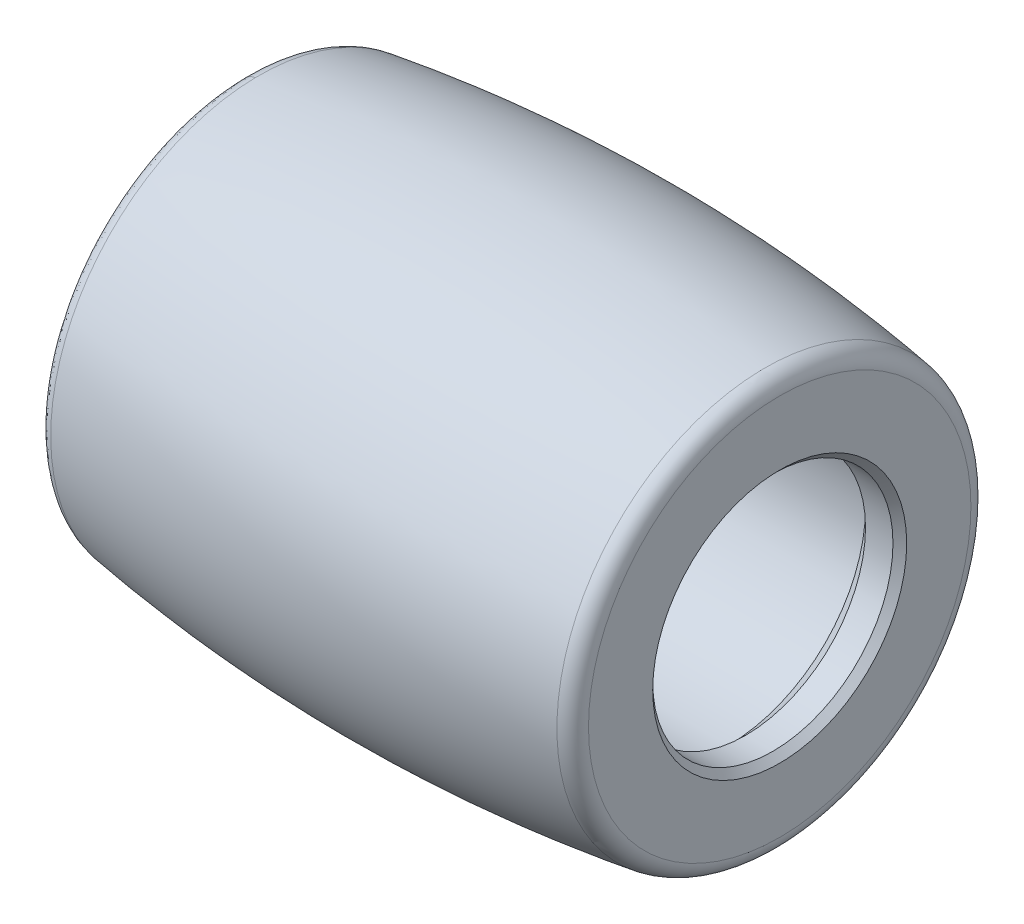
ISO-10303-21;
HEADER;
FILE_DESCRIPTION(('STEP AP214'),'2;1');
FILE_NAME('part.step','',(''),(''),'','','');
FILE_SCHEMA(('AUTOMOTIVE_DESIGN { 1 0 10303 214 1 1 1 1 }'));
ENDSEC;
DATA;
#1=APPLICATION_CONTEXT('core data for automotive mechanical design processes');
#2=APPLICATION_PROTOCOL_DEFINITION('international standard','automotive_design',2000,#1);
#3=PRODUCT_CONTEXT('',#1,'mechanical');
#4=PRODUCT('Part','Part','',(#3));
#5=PRODUCT_RELATED_PRODUCT_CATEGORY('part','',(#4));
#6=PRODUCT_DEFINITION_FORMATION('','',#4);
#7=PRODUCT_DEFINITION_CONTEXT('part definition',#1,'design');
#8=PRODUCT_DEFINITION('design','',#6,#7);
#9=PRODUCT_DEFINITION_SHAPE('','',#8);
#10=(LENGTH_UNIT() NAMED_UNIT(*) SI_UNIT(.MILLI.,.METRE.));
#11=(NAMED_UNIT(*) PLANE_ANGLE_UNIT() SI_UNIT($,.RADIAN.));
#12=(NAMED_UNIT(*) SI_UNIT($,.STERADIAN.) SOLID_ANGLE_UNIT());
#13=UNCERTAINTY_MEASURE_WITH_UNIT(LENGTH_MEASURE(1.E-05),#10,'distance_accuracy_value','');
#14=(GEOMETRIC_REPRESENTATION_CONTEXT(3) GLOBAL_UNCERTAINTY_ASSIGNED_CONTEXT((#13)) GLOBAL_UNIT_ASSIGNED_CONTEXT((#10,
#11,#12)) REPRESENTATION_CONTEXT('',''));
#15=CARTESIAN_POINT('',(0.,0.,0.));
#16=DIRECTION('',(0.,0.,1.));
#17=DIRECTION('',(1.,0.,0.));
#18=AXIS2_PLACEMENT_3D('',#15,#16,#17);
#19=CARTESIAN_POINT('',(-7.8,0.,0.));
#20=DIRECTION('',(-1.,0.,0.));
#21=DIRECTION('',(0.,0.,1.));
#22=AXIS2_PLACEMENT_3D('',#19,#20,#21);
#23=CYLINDRICAL_SURFACE('',#22,4.);
#24=CARTESIAN_POINT('',(6.29999999995334,0.,0.));
#25=DIRECTION('',(-1.,0.,0.));
#26=DIRECTION('',(0.,0.,1.));
#27=AXIS2_PLACEMENT_3D('',#24,#25,#26);
#28=CIRCLE('',#27,3.99999999996226);
#29=CARTESIAN_POINT('',(6.29999999995334,0.,3.99999999996226));
#30=VERTEX_POINT('',#29);
#31=EDGE_CURVE('E97',#30,#30,#28,.F.);
#32=ORIENTED_EDGE('',*,*,#31,.T.);
#33=EDGE_LOOP('',(#32));
#34=FACE_BOUND('',#33,.T.);
#35=CARTESIAN_POINT('',(-6.29999999995334,0.,0.));
#36=DIRECTION('',(1.,0.,0.));
#37=DIRECTION('',(0.,0.,-1.));
#38=AXIS2_PLACEMENT_3D('',#35,#36,#37);
#39=CIRCLE('',#38,3.99999999996226);
#40=CARTESIAN_POINT('',(-6.29999999995334,0.,-3.99999999996226));
#41=VERTEX_POINT('',#40);
#42=EDGE_CURVE('E100',#41,#41,#39,.F.);
#43=ORIENTED_EDGE('',*,*,#42,.T.);
#44=EDGE_LOOP('',(#43));
#45=FACE_BOUND('',#44,.T.);
#46=ADVANCED_FACE('F17',(#34,#45),#23,.F.);
#47=CARTESIAN_POINT('',(-6.29999999995334,0.,0.));
#48=DIRECTION('',(1.,0.,0.));
#49=DIRECTION('',(0.,0.,-1.));
#50=AXIS2_PLACEMENT_3D('',#47,#48,#49);
#51=CONICAL_SURFACE('',#50,3.99999999996226,0.785398163340605);
#52=CARTESIAN_POINT('',(-6.8,0.,0.));
#53=DIRECTION('',(1.,0.,0.));
#54=DIRECTION('',(0.,0.,-1.));
#55=AXIS2_PLACEMENT_3D('',#52,#53,#54);
#56=CIRCLE('',#55,3.5);
#57=CARTESIAN_POINT('',(-6.8,0.,-3.5));
#58=VERTEX_POINT('',#57);
#59=EDGE_CURVE('E94',#58,#58,#56,.F.);
#60=ORIENTED_EDGE('',*,*,#59,.T.);
#61=EDGE_LOOP('',(#60));
#62=FACE_BOUND('',#61,.T.);
#63=ORIENTED_EDGE('',*,*,#42,.F.);
#64=EDGE_LOOP('',(#63));
#65=FACE_BOUND('',#64,.T.);
#66=ADVANCED_FACE('F191',(#62,#65),#51,.F.);
#67=CARTESIAN_POINT('',(6.29999999995334,0.,0.));
#68=DIRECTION('',(-1.,0.,0.));
#69=DIRECTION('',(0.,0.,1.));
#70=AXIS2_PLACEMENT_3D('',#67,#68,#69);
#71=CONICAL_SURFACE('',#70,3.99999999996226,0.785398163340605);
#72=CARTESIAN_POINT('',(6.8,0.,0.));
#73=DIRECTION('',(1.,0.,0.));
#74=DIRECTION('',(0.,0.,-1.));
#75=AXIS2_PLACEMENT_3D('',#72,#73,#74);
#76=CIRCLE('',#75,3.5);
#77=CARTESIAN_POINT('',(6.8,0.,-3.5));
#78=VERTEX_POINT('',#77);
#79=EDGE_CURVE('E91',#78,#78,#76,.T.);
#80=ORIENTED_EDGE('',*,*,#79,.T.);
#81=EDGE_LOOP('',(#80));
#82=FACE_BOUND('',#81,.T.);
#83=ORIENTED_EDGE('',*,*,#31,.F.);
#84=EDGE_LOOP('',(#83));
#85=FACE_BOUND('',#84,.T.);
#86=ADVANCED_FACE('F195',(#82,#85),#71,.F.);
#87=CARTESIAN_POINT('',(-7.8,0.,0.));
#88=DIRECTION('',(1.,0.,0.));
#89=DIRECTION('',(0.,0.,-1.));
#90=AXIS2_PLACEMENT_3D('',#87,#88,#89);
#91=CYLINDRICAL_SURFACE('',#90,3.5);
#92=CARTESIAN_POINT('',(-7.60000000002492,0.,0.));
#93=DIRECTION('',(-1.,0.,0.));
#94=DIRECTION('',(0.,0.,1.));
#95=AXIS2_PLACEMENT_3D('',#92,#93,#94);
#96=CIRCLE('',#95,3.50000000003092);
#97=CARTESIAN_POINT('',(-7.60000000002492,0.,3.50000000003092));
#98=VERTEX_POINT('',#97);
#99=EDGE_CURVE('E88',#98,#98,#96,.T.);
#100=ORIENTED_EDGE('',*,*,#99,.T.);
#101=EDGE_LOOP('',(#100));
#102=FACE_BOUND('',#101,.T.);
#103=ORIENTED_EDGE('',*,*,#59,.F.);
#104=EDGE_LOOP('',(#103));
#105=FACE_BOUND('',#104,.T.);
#106=ADVANCED_FACE('F199',(#102,#105),#91,.F.);
#107=CARTESIAN_POINT('',(7.8,0.,0.));
#108=DIRECTION('',(1.,0.,0.));
#109=DIRECTION('',(0.,0.,-1.));
#110=AXIS2_PLACEMENT_3D('',#107,#108,#109);
#111=CYLINDRICAL_SURFACE('',#110,3.5);
#112=ORIENTED_EDGE('',*,*,#79,.F.);
#113=EDGE_LOOP('',(#112));
#114=FACE_BOUND('',#113,.T.);
#115=CARTESIAN_POINT('',(7.60000000002492,0.,0.));
#116=DIRECTION('',(1.,0.,0.));
#117=DIRECTION('',(0.,0.,-1.));
#118=AXIS2_PLACEMENT_3D('',#115,#116,#117);
#119=CIRCLE('',#118,3.50000000003092);
#120=CARTESIAN_POINT('',(7.60000000002492,0.,-3.50000000003092));
#121=VERTEX_POINT('',#120);
#122=EDGE_CURVE('E85',#121,#121,#119,.T.);
#123=ORIENTED_EDGE('',*,*,#122,.T.);
#124=EDGE_LOOP('',(#123));
#125=FACE_BOUND('',#124,.T.);
#126=ADVANCED_FACE('F203',(#114,#125),#111,.F.);
#127=CARTESIAN_POINT('',(-7.79999999991787,0.,0.));
#128=DIRECTION('',(-1.,0.,0.));
#129=DIRECTION('',(0.,0.,1.));
#130=AXIS2_PLACEMENT_3D('',#127,#128,#129);
#131=CONICAL_SURFACE('',#130,3.69999999992388,0.785398163397448);
#132=ORIENTED_EDGE('',*,*,#99,.F.);
#133=EDGE_LOOP('',(#132));
#134=FACE_BOUND('',#133,.T.);
#135=CARTESIAN_POINT('',(-7.79999999997472,0.,0.));
#136=DIRECTION('',(-1.,0.,0.));
#137=DIRECTION('',(0.,0.,1.));
#138=AXIS2_PLACEMENT_3D('',#135,#136,#137);
#139=CIRCLE('',#138,3.69999999998072);
#140=CARTESIAN_POINT('',(-7.79999999997472,0.,3.69999999998072));
#141=VERTEX_POINT('',#140);
#142=EDGE_CURVE('E21',#141,#141,#139,.T.);
#143=ORIENTED_EDGE('',*,*,#142,.T.);
#144=EDGE_LOOP('',(#143));
#145=FACE_BOUND('',#144,.T.);
#146=ADVANCED_FACE('F114',(#134,#145),#131,.F.);
#147=CARTESIAN_POINT('',(7.79999999991787,0.,0.));
#148=DIRECTION('',(1.,0.,0.));
#149=DIRECTION('',(0.,0.,-1.));
#150=AXIS2_PLACEMENT_3D('',#147,#148,#149);
#151=CONICAL_SURFACE('',#150,3.69999999992388,0.785398163397448);
#152=ORIENTED_EDGE('',*,*,#122,.F.);
#153=EDGE_LOOP('',(#152));
#154=FACE_BOUND('',#153,.T.);
#155=CARTESIAN_POINT('',(7.79999999997472,0.,0.));
#156=DIRECTION('',(1.,0.,0.));
#157=DIRECTION('',(0.,0.,-1.));
#158=AXIS2_PLACEMENT_3D('',#155,#156,#157);
#159=CIRCLE('',#158,3.69999999998072);
#160=CARTESIAN_POINT('',(7.79999999997472,0.,-3.69999999998072));
#161=VERTEX_POINT('',#160);
#162=EDGE_CURVE('E107',#161,#161,#159,.F.);
#163=ORIENTED_EDGE('',*,*,#162,.F.);
#164=EDGE_LOOP('',(#163));
#165=FACE_BOUND('',#164,.T.);
#166=ADVANCED_FACE('F119',(#154,#165),#151,.F.);
#167=CARTESIAN_POINT('',(-7.8,0.,0.));
#168=DIRECTION('',(1.,0.,0.));
#169=DIRECTION('',(0.,0.,-1.));
#170=AXIS2_PLACEMENT_3D('',#167,#168,#169);
#171=PLANE('',#170);
#172=CARTESIAN_POINT('',(-7.79999999999449,0.,0.));
#173=DIRECTION('',(1.,0.,0.));
#174=DIRECTION('',(0.,0.,-1.));
#175=AXIS2_PLACEMENT_3D('',#172,#173,#174);
#176=CIRCLE('',#175,5.57090774301135);
#177=CARTESIAN_POINT('',(-7.79999999999999,-5.57004626982092,-0.0978542123005588));
#178=VERTEX_POINT('',#177);
#179=CARTESIAN_POINT('',(-7.79999999999998,5.57004678112858,0.0978542212409668));
#180=VERTEX_POINT('',#179);
#181=EDGE_CURVE('E71',#178,#180,#176,.T.);
#182=ORIENTED_EDGE('',*,*,#181,.F.);
#183=CARTESIAN_POINT('',(-7.79999999999997,5.57004575570599,0.0978542032264107));
#184=CARTESIAN_POINT('',(-7.79999999999997,5.51272409059025,3.36071146393327));
#185=CARTESIAN_POINT('',(-7.79999999999997,3.1650030573652,5.62736742088657));
#186=CARTESIAN_POINT('',(-7.79999999999997,-0.0978542033404914,5.57004575570399));
#187=CARTESIAN_POINT('',(-7.79999999999997,-3.36071146404618,5.51272409052141));
#188=CARTESIAN_POINT('',(-7.79999999999997,-5.62736742095139,3.16500305724994));
#189=CARTESIAN_POINT('',(-7.79999999999997,-5.57004575570199,-0.0978542034545722));
#190=(BOUNDED_CURVE() B_SPLINE_CURVE(3,(#183,#184,#185,#186,#187,#188,#189),.UNSPECIFIED.,.F.,
.F.) B_SPLINE_CURVE_WITH_KNOTS((4,3,4),(0.,0.5,1.),
.UNSPECIFIED.) CURVE() GEOMETRIC_REPRESENTATION_ITEM() RATIONAL_B_SPLINE_CURVE((0.999999979139221,
0.804737837332079,0.804737837332079,0.999999979139221,0.804737837332079,0.804737837332079,0.999999979139221)) REPRESENTATION_ITEM(''));
#191=CARTESIAN_POINT('',(-7.79999999999999,-5.57090524456598,-5.69197440494085E-11));
#192=VERTEX_POINT('',#191);
#193=EDGE_CURVE('E73',#192,#178,#190,.T.);
#194=ORIENTED_EDGE('',*,*,#193,.F.);
#195=CARTESIAN_POINT('',(-7.79999999999997,5.5700457276261,0.0978542027331049));
#196=CARTESIAN_POINT('',(-7.79999999999997,5.51272406279932,3.36071144699114));
#197=CARTESIAN_POINT('',(-7.79999999999997,3.16500304140968,5.6273673925177));
#198=CARTESIAN_POINT('',(-7.79999999999997,-0.0978542028471856,5.57004572762409));
#199=CARTESIAN_POINT('',(-7.79999999999997,-3.36071144710405,5.51272406273049));
#200=CARTESIAN_POINT('',(-7.79999999999997,-5.62736739258252,3.16500304129442));
#201=CARTESIAN_POINT('',(-7.79999999999997,-5.57004572762209,-0.0978542029612663));
#202=(BOUNDED_CURVE() B_SPLINE_CURVE(3,(#195,#196,#197,#198,#199,#200,#201),.UNSPECIFIED.,.F.,
.F.) B_SPLINE_CURVE_WITH_KNOTS((4,3,4),(0.,0.5,1.),
.UNSPECIFIED.) CURVE() GEOMETRIC_REPRESENTATION_ITEM() RATIONAL_B_SPLINE_CURVE((1.,
0.804737854119538,0.804737854119538,1.,0.804737854119538,0.804737854119538,1.)) REPRESENTATION_ITEM(''));
#203=EDGE_CURVE('E76',#180,#192,#202,.T.);
#204=ORIENTED_EDGE('',*,*,#203,.F.);
#205=EDGE_LOOP('',(#182,#194,#204));
#206=FACE_BOUND('',#205,.T.);
#207=ORIENTED_EDGE('',*,*,#142,.F.);
#208=EDGE_LOOP('',(#207));
#209=FACE_BOUND('',#208,.T.);
#210=ADVANCED_FACE('F116',(#206,#209),#171,.F.);
#211=CARTESIAN_POINT('',(7.8,0.,0.));
#212=DIRECTION('',(1.,0.,0.));
#213=DIRECTION('',(0.,0.,-1.));
#214=AXIS2_PLACEMENT_3D('',#211,#212,#213);
#215=PLANE('',#214);
#216=CARTESIAN_POINT('',(7.79999999999999,0.,0.));
#217=DIRECTION('',(1.,0.,0.));
#218=DIRECTION('',(0.,0.,-1.));
#219=AXIS2_PLACEMENT_3D('',#216,#217,#218);
#220=CIRCLE('',#219,5.570905317122);
#221=CARTESIAN_POINT('',(7.8,-5.570905317122,-2.89578609572252E-11));
#222=VERTEX_POINT('',#221);
#223=CARTESIAN_POINT('',(7.8,-5.57051217530674,-0.0662360816136397));
#224=VERTEX_POINT('',#223);
#225=EDGE_CURVE('E63',#222,#224,#220,.F.);
#226=ORIENTED_EDGE('',*,*,#225,.F.);
#227=DIRECTION('',(0.,0.00592639088267769,-0.999982438791355));
#228=VECTOR('',#227,1.);
#229=CARTESIAN_POINT('',(7.8,-5.570905317122,-2.90237152677025E-11));
#230=LINE('',#229,#228);
#231=EDGE_CURVE('E52',#222,#224,#230,.T.);
#232=ORIENTED_EDGE('',*,*,#231,.T.);
#233=EDGE_LOOP('',(#226,#232));
#234=FACE_BOUND('',#233,.T.);
#235=ORIENTED_EDGE('',*,*,#162,.T.);
#236=EDGE_LOOP('',(#235));
#237=FACE_BOUND('',#236,.T.);
#238=ADVANCED_FACE('F118',(#234,#237),#215,.T.);
#239=CARTESIAN_POINT('',(-7.37373740775297,6.06450252359326,0.106540787713073));
#240=CARTESIAN_POINT('',(-7.37373740775297,6.00209237509584,3.65904411704583));
#241=CARTESIAN_POINT('',(-7.37373740775297,3.4459625414942,6.12691267216125));
#242=CARTESIAN_POINT('',(-7.37373740775297,-0.106540787837281,6.06450252359108));
#243=CARTESIAN_POINT('',(-7.37373740775297,-3.65904411716876,6.0020923750209));
#244=CARTESIAN_POINT('',(-7.37373740775297,-6.12691267223183,3.44596254136871));
#245=CARTESIAN_POINT('',(-7.37373740775297,-6.06450252358889,-0.106540787961488));
#246=CARTESIAN_POINT('',(-7.63050584751633,6.02622293113805,0.105868294311075));
#247=CARTESIAN_POINT('',(-7.63050584751633,5.96420672015492,3.63594795754532));
#248=CARTESIAN_POINT('',(-7.63050584751633,3.42421136879848,6.08823914219131));
#249=CARTESIAN_POINT('',(-7.63050584751633,-0.105868294434499,6.02622293113588));
#250=CARTESIAN_POINT('',(-7.63050584751633,-3.63594795766748,5.96420672008045));
#251=CARTESIAN_POINT('',(-7.63050584751633,-6.08823914226144,3.42421136867378));
#252=CARTESIAN_POINT('',(-7.63050584751633,-6.02622293113371,-0.105868294557923));
#253=CARTESIAN_POINT('',(-7.80000009718541,5.8296127074185,0.102414258629495));
#254=CARTESIAN_POINT('',(-7.80000009718541,5.76961982369276,3.51732231930817));
#255=CARTESIAN_POINT('',(-7.80000009718541,3.31249380192856,5.88960559121209));
#256=CARTESIAN_POINT('',(-7.80000009718541,-0.102414258748892,5.82961270741641));
#257=CARTESIAN_POINT('',(-7.80000009718541,-3.51732231942634,5.76961982362072));
#258=CARTESIAN_POINT('',(-7.80000009718541,-5.88960559127994,3.31249380180793));
#259=CARTESIAN_POINT('',(-7.80000009718541,-5.82961270741431,-0.102414258868289));
#260=CARTESIAN_POINT('',(-7.79999999999997,5.57004572763364,0.0978542027332373));
#261=CARTESIAN_POINT('',(-7.79999999999997,5.51272406280678,3.36071144699569));
#262=CARTESIAN_POINT('',(-7.79999999999997,3.16500304141396,5.62736739252531));
#263=CARTESIAN_POINT('',(-7.79999999999997,-0.0978542028473181,5.57004572763163));
#264=CARTESIAN_POINT('',(-7.79999999999997,-3.3607114471086,5.51272406273795));
#265=CARTESIAN_POINT('',(-7.79999999999997,-5.62736739259014,3.16500304129871));
#266=CARTESIAN_POINT('',(-7.79999999999997,-5.57004572762963,-0.0978542029613988));
#267=CARTESIAN_POINT('',(-7.79999999992509,5.56984575848973,0.0978506896882634));
#268=CARTESIAN_POINT('',(-7.79999999992509,5.51252615155697,3.36059079473827));
#269=CARTESIAN_POINT('',(-7.79999999992509,3.1648894152465,5.6271653654873));
#270=CARTESIAN_POINT('',(-7.79999999992509,-0.09785068980234,5.56984575848772));
#271=CARTESIAN_POINT('',(-7.79999999992509,-3.36059079485117,5.51252615148814));
#272=CARTESIAN_POINT('',(-7.79999999992509,-5.62716536555212,3.16488941513124));
#273=CARTESIAN_POINT('',(-7.79999999992509,-5.56984575848572,-0.0978506899164166));
#274=CARTESIAN_POINT('',(-7.79999999985022,5.56964578934582,0.0978471766432894));
#275=CARTESIAN_POINT('',(-7.79999999985022,5.51232824030717,3.36047014248085));
#276=CARTESIAN_POINT('',(-7.79999999985022,3.16477578907903,5.62696333844929));
#277=CARTESIAN_POINT('',(-7.79999999985022,-0.0978471767573619,5.56964578934382));
#278=CARTESIAN_POINT('',(-7.79999999985022,-3.36047014259375,5.51232824023834));
#279=CARTESIAN_POINT('',(-7.79999999985022,-5.62696333851411,3.16477578896378));
#280=CARTESIAN_POINT('',(-7.79999999985022,-5.56964578934181,-0.0978471768714344));
#281=CARTESIAN_POINT('',(-7.79999999977535,5.56944582020192,0.0978436635983154));
#282=CARTESIAN_POINT('',(-7.79999999977535,5.51213032905736,3.36034949022343));
#283=CARTESIAN_POINT('',(-7.79999999977535,3.16466216291156,5.62676131141128));
#284=CARTESIAN_POINT('',(-7.79999999977535,-0.0978436637123838,5.56944582019991));
#285=CARTESIAN_POINT('',(-7.79999999977535,-3.36034949033632,5.51213032898854));
#286=CARTESIAN_POINT('',(-7.79999999977535,-5.6267613114761,3.16466216279632));
#287=CARTESIAN_POINT('',(-7.79999999977535,-5.56944582019791,-0.0978436638264523));
#288=(BOUNDED_SURFACE() B_SPLINE_SURFACE(3,3,((#239,#240,#241,#242,#243,#244,#245),(#246,#247,
#248,#249,#250,#251,#252),(#253,#254,#255,#256,#257,#258,#259),(#260,#261,#262,#263,#264,#265,
#266),(#267,#268,#269,#270,#271,#272,#273),(#274,#275,#276,#277,#278,#279,#280),(#281,#282,#283,
#284,#285,#286,#287)),.UNSPECIFIED.,.F.,.F.,.F.) B_SPLINE_SURFACE_WITH_KNOTS((4,3,4),(4,3,4),
(0.,1.,1.00091899372339),(0.,0.5,1.),
.UNSPECIFIED.) GEOMETRIC_REPRESENTATION_ITEM() RATIONAL_B_SPLINE_SURFACE(((1.,0.804737854119538,
0.804737854119538,1.,0.804737854119538,0.804737854119538,1.),(0.838302957335766,
0.674614122988446,0.674614122988446,0.838302957335766,0.674614122988446,0.674614122988446,
0.838302957335766),(0.838302957335766,0.674614122988446,0.674614122988446,0.838302957335766,
0.674614122988446,0.674614122988446,0.838302957335766),(1.,0.804737854119538,0.804737854119538,
1.,0.804737854119538,0.804737854119538,1.),(1.,0.804737854119538,0.804737854119538,1.,
0.804737854119538,0.804737854119538,1.),(1.,0.804737854119538,0.804737854119538,1.,
0.804737854119538,0.804737854119538,1.),(1.,0.804737854119538,0.804737854119538,1.,
0.804737854119538,0.804737854119538,1.))) REPRESENTATION_ITEM('') SURFACE());
#289=CARTESIAN_POINT('',(-7.3,-5.57004591478283,-0.0978542060167685));
#290=DIRECTION('',(0.,0.0175652248691231,-0.999845719536418));
#291=DIRECTION('',(0.,0.999845719536418,0.0175652248691231));
#292=AXIS2_PLACEMENT_3D('',#289,#290,#291);
#293=CIRCLE('',#292,0.500000000000003);
#294=CARTESIAN_POINT('',(-7.3737374077531,-6.06450252359332,-0.106540787708399));
#295=VERTEX_POINT('',#294);
#296=EDGE_CURVE('E35',#295,#178,#293,.T.);
#297=CARTESIAN_POINT('',(-7.37373740775296,0.,-1.35308431126191E-13));
#298=DIRECTION('',(1.,0.,0.));
#299=DIRECTION('',(0.,0.,-1.));
#300=AXIS2_PLACEMENT_3D('',#297,#298,#299);
#301=CIRCLE('',#300,6.06543830222605);
#302=CARTESIAN_POINT('',(-7.37373740775295,6.06450252358989,0.106540787899383));
#303=VERTEX_POINT('',#302);
#304=EDGE_CURVE('E56',#303,#295,#301,.T.);
#305=CARTESIAN_POINT('',(-7.3,5.57004591477875,0.0978542062492216));
#306=DIRECTION('',(0.,0.0175652249108496,-0.999845719535685));
#307=DIRECTION('',(0.,0.999845719535685,0.0175652249108496));
#308=AXIS2_PLACEMENT_3D('',#305,#306,#307);
#309=CIRCLE('',#308,0.500000000000003);
#310=EDGE_CURVE('E61',#180,#303,#309,.T.);
#311=ORIENTED_EDGE('',*,*,#296,.F.);
#312=ORIENTED_EDGE('',*,*,#304,.F.);
#313=ORIENTED_EDGE('',*,*,#310,.F.);
#314=ORIENTED_EDGE('',*,*,#203,.T.);
#315=ORIENTED_EDGE('',*,*,#193,.T.);
#316=EDGE_LOOP('',(#311,#312,#313,#314,#315));
#317=FACE_BOUND('',#316,.T.);
#318=ADVANCED_FACE('F58',(#317),#288,.T.);
#319=CARTESIAN_POINT('',(-7.3,0.,0.));
#320=DIRECTION('',(1.,0.,0.));
#321=DIRECTION('',(0.,0.,-1.));
#322=AXIS2_PLACEMENT_3D('',#319,#320,#321);
#323=TOROIDAL_SURFACE('',#322,5.57090539665,0.500000000000003);
#324=ORIENTED_EDGE('',*,*,#181,.T.);
#325=ORIENTED_EDGE('',*,*,#310,.T.);
#326=CARTESIAN_POINT('',(-7.37373740775345,0.,-1.35308431126191E-13));
#327=DIRECTION('',(1.,0.,0.));
#328=DIRECTION('',(0.,0.,-1.));
#329=AXIS2_PLACEMENT_3D('',#326,#327,#328);
#330=CIRCLE('',#329,6.06543830222598);
#331=EDGE_CURVE('E27',#295,#303,#330,.T.);
#332=ORIENTED_EDGE('',*,*,#331,.F.);
#333=ORIENTED_EDGE('',*,*,#296,.T.);
#334=EDGE_LOOP('',(#324,#325,#332,#333));
#335=FACE_BOUND('',#334,.T.);
#336=ADVANCED_FACE('F69',(#335),#323,.T.);
#337=CARTESIAN_POINT('',(7.3,0.,0.));
#338=DIRECTION('',(1.,0.,0.));
#339=DIRECTION('',(0.,0.,-1.));
#340=AXIS2_PLACEMENT_3D('',#337,#338,#339);
#341=TOROIDAL_SURFACE('',#340,5.57090539665,0.500000000000005);
#342=CARTESIAN_POINT('',(7.37373739217235,0.,-1.35308431126191E-13));
#343=DIRECTION('',(1.,0.,0.));
#344=DIRECTION('',(0.,0.,-1.));
#345=AXIS2_PLACEMENT_3D('',#342,#343,#344);
#346=CIRCLE('',#345,6.06543830454967);
#347=CARTESIAN_POINT('',(7.37373739217235,0.,-6.0654383045498));
#348=VERTEX_POINT('',#347);
#349=EDGE_CURVE('E11',#348,#348,#346,.F.);
#350=ORIENTED_EDGE('',*,*,#349,.F.);
#351=EDGE_LOOP('',(#350));
#352=FACE_BOUND('',#351,.T.);
#353=ORIENTED_EDGE('',*,*,#225,.T.);
#354=ORIENTED_EDGE('',*,*,#231,.F.);
#355=EDGE_LOOP('',(#353,#354));
#356=FACE_BOUND('',#355,.T.);
#357=ADVANCED_FACE('F19',(#352,#356),#341,.T.);
#358=CARTESIAN_POINT('',(1.57903204400789E-12,0.,43.3878527575467));
#359=DIRECTION('',(0.,1.,0.));
#360=DIRECTION('',(0.,0.,-1.));
#361=AXIS2_PLACEMENT_3D('',#358,#359,#360);
#362=CIRCLE('',#361,50.0000000000113);
#363=TRIMMED_CURVE('',#362,(PARAMETER_VALUE(-0.520125015553683)),
(PARAMETER_VALUE(0.520125015553683)),.T.,.PARAMETER.);
#364=CARTESIAN_POINT('',(1.57903204400789E-12,0.,-1.35308431126191E-13));
#365=DIRECTION('',(1.,0.,0.));
#366=AXIS1_PLACEMENT('',#364,#365);
#367=SURFACE_OF_REVOLUTION('',#363,#366);
#368=ORIENTED_EDGE('',*,*,#331,.T.);
#369=ORIENTED_EDGE('',*,*,#304,.T.);
#370=EDGE_LOOP('',(#368,#369));
#371=FACE_BOUND('',#370,.T.);
#372=ORIENTED_EDGE('',*,*,#349,.T.);
#373=EDGE_LOOP('',(#372));
#374=FACE_BOUND('',#373,.T.);
#375=ADVANCED_FACE('F65',(#371,#374),#367,.F.);
#376=CLOSED_SHELL('',(#46,#66,#86,#106,#126,#146,#166,#210,#238,#318,#336,#357,#375));
#377=MANIFOLD_SOLID_BREP('B1',#376);
#378=ADVANCED_BREP_SHAPE_REPRESENTATION('',(#18,#377),#14);
#379=SHAPE_DEFINITION_REPRESENTATION(#9,#378);
ENDSEC;
END-ISO-10303-21;
